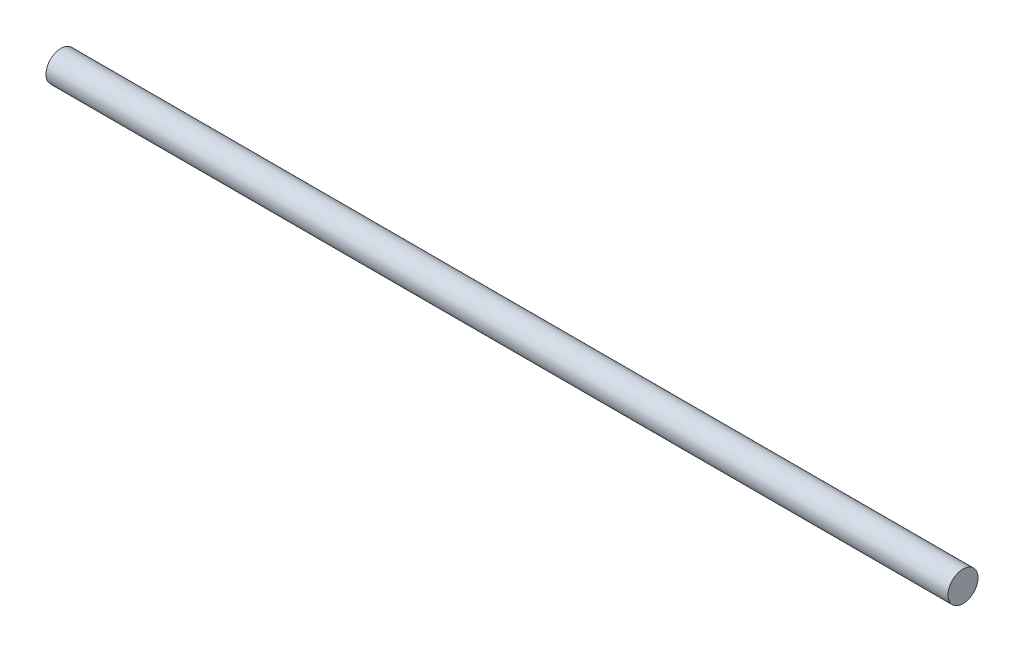
ISO-10303-21;
HEADER;
FILE_DESCRIPTION(('STEP AP214'),'2;1');
FILE_NAME('part.step','',(''),(''),'','','');
FILE_SCHEMA(('AUTOMOTIVE_DESIGN { 1 0 10303 214 1 1 1 1 }'));
ENDSEC;
DATA;
#1=APPLICATION_CONTEXT('core data for automotive mechanical design processes');
#2=APPLICATION_PROTOCOL_DEFINITION('international standard','automotive_design',2000,#1);
#3=PRODUCT_CONTEXT('',#1,'mechanical');
#4=PRODUCT('Part','Part','',(#3));
#5=PRODUCT_RELATED_PRODUCT_CATEGORY('part','',(#4));
#6=PRODUCT_DEFINITION_FORMATION('','',#4);
#7=PRODUCT_DEFINITION_CONTEXT('part definition',#1,'design');
#8=PRODUCT_DEFINITION('design','',#6,#7);
#9=PRODUCT_DEFINITION_SHAPE('','',#8);
#10=(LENGTH_UNIT() NAMED_UNIT(*) SI_UNIT(.MILLI.,.METRE.));
#11=(NAMED_UNIT(*) PLANE_ANGLE_UNIT() SI_UNIT($,.RADIAN.));
#12=(NAMED_UNIT(*) SI_UNIT($,.STERADIAN.) SOLID_ANGLE_UNIT());
#13=UNCERTAINTY_MEASURE_WITH_UNIT(LENGTH_MEASURE(1.E-05),#10,'distance_accuracy_value','');
#14=(GEOMETRIC_REPRESENTATION_CONTEXT(3) GLOBAL_UNCERTAINTY_ASSIGNED_CONTEXT((#13)) GLOBAL_UNIT_ASSIGNED_CONTEXT((#10,
#11,#12)) REPRESENTATION_CONTEXT('',''));
#15=CARTESIAN_POINT('',(0.,0.,0.));
#16=DIRECTION('',(0.,0.,1.));
#17=DIRECTION('',(1.,0.,0.));
#18=AXIS2_PLACEMENT_3D('',#15,#16,#17);
#19=CARTESIAN_POINT('',(190.7633964122,0.,0.));
#20=DIRECTION('',(-1.,0.,0.));
#21=DIRECTION('',(0.,0.,1.));
#22=AXIS2_PLACEMENT_3D('',#19,#20,#21);
#23=CYLINDRICAL_SURFACE('',#22,3.175);
#24=CARTESIAN_POINT('',(190.7633964122,0.,0.));
#25=DIRECTION('',(1.,0.,0.));
#26=DIRECTION('',(0.,0.,-1.));
#27=AXIS2_PLACEMENT_3D('',#24,#25,#26);
#28=CIRCLE('',#27,3.175);
#29=CARTESIAN_POINT('',(190.7633964122,0.,-3.175));
#30=VERTEX_POINT('',#29);
#31=EDGE_CURVE('E11',#30,#30,#28,.T.);
#32=ORIENTED_EDGE('',*,*,#31,.F.);
#33=EDGE_LOOP('',(#32));
#34=FACE_BOUND('',#33,.T.);
#35=CARTESIAN_POINT('',(0.,0.,0.));
#36=DIRECTION('',(1.,0.,0.));
#37=DIRECTION('',(0.,0.,-1.));
#38=AXIS2_PLACEMENT_3D('',#35,#36,#37);
#39=CIRCLE('',#38,3.175);
#40=CARTESIAN_POINT('',(0.,0.,-3.175));
#41=VERTEX_POINT('',#40);
#42=EDGE_CURVE('E51',#41,#41,#39,.T.);
#43=ORIENTED_EDGE('',*,*,#42,.T.);
#44=EDGE_LOOP('',(#43));
#45=FACE_BOUND('',#44,.T.);
#46=ADVANCED_FACE('F48',(#34,#45),#23,.T.);
#47=CARTESIAN_POINT('',(190.7633964122,0.,0.));
#48=DIRECTION('',(1.,0.,0.));
#49=DIRECTION('',(0.,0.,-1.));
#50=AXIS2_PLACEMENT_3D('',#47,#48,#49);
#51=PLANE('',#50);
#52=ORIENTED_EDGE('',*,*,#31,.T.);
#53=EDGE_LOOP('',(#52));
#54=FACE_BOUND('',#53,.T.);
#55=ADVANCED_FACE('F66',(#54),#51,.T.);
#56=CARTESIAN_POINT('',(0.,0.,0.));
#57=DIRECTION('',(1.,0.,0.));
#58=DIRECTION('',(0.,0.,-1.));
#59=AXIS2_PLACEMENT_3D('',#56,#57,#58);
#60=PLANE('',#59);
#61=ORIENTED_EDGE('',*,*,#42,.F.);
#62=EDGE_LOOP('',(#61));
#63=FACE_BOUND('',#62,.T.);
#64=ADVANCED_FACE('F64',(#63),#60,.F.);
#65=CLOSED_SHELL('',(#46,#55,#64));
#66=MANIFOLD_SOLID_BREP('B2',#65);
#67=ADVANCED_BREP_SHAPE_REPRESENTATION('',(#18,#66),#14);
#68=SHAPE_DEFINITION_REPRESENTATION(#9,#67);
ENDSEC;
END-ISO-10303-21;
